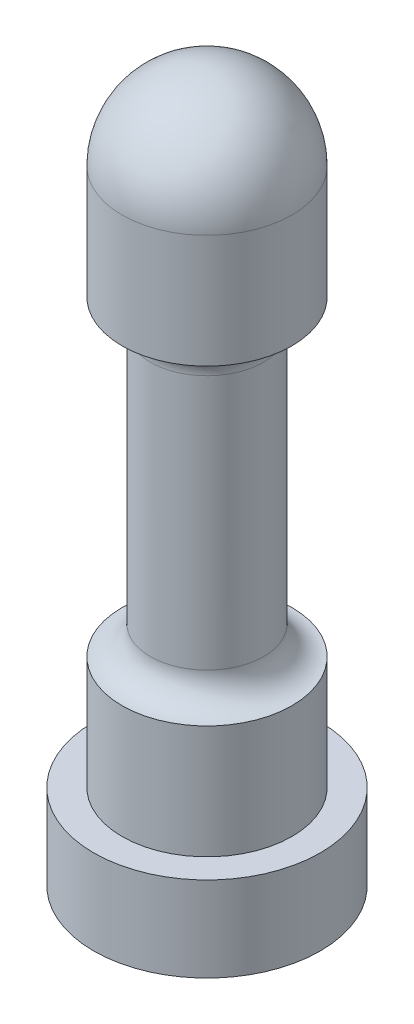
ISO-10303-21;
HEADER;
FILE_DESCRIPTION(('STEP AP214'),'2;1');
FILE_NAME('part.step','',(''),(''),'','','');
FILE_SCHEMA(('AUTOMOTIVE_DESIGN { 1 0 10303 214 1 1 1 1 }'));
ENDSEC;
DATA;
#1=APPLICATION_CONTEXT('core data for automotive mechanical design processes');
#2=APPLICATION_PROTOCOL_DEFINITION('international standard','automotive_design',2000,#1);
#3=PRODUCT_CONTEXT('',#1,'mechanical');
#4=PRODUCT('Part','Part','',(#3));
#5=PRODUCT_RELATED_PRODUCT_CATEGORY('part','',(#4));
#6=PRODUCT_DEFINITION_FORMATION('','',#4);
#7=PRODUCT_DEFINITION_CONTEXT('part definition',#1,'design');
#8=PRODUCT_DEFINITION('design','',#6,#7);
#9=PRODUCT_DEFINITION_SHAPE('','',#8);
#10=(LENGTH_UNIT() NAMED_UNIT(*) SI_UNIT(.MILLI.,.METRE.));
#11=(NAMED_UNIT(*) PLANE_ANGLE_UNIT() SI_UNIT($,.RADIAN.));
#12=(NAMED_UNIT(*) SI_UNIT($,.STERADIAN.) SOLID_ANGLE_UNIT());
#13=UNCERTAINTY_MEASURE_WITH_UNIT(LENGTH_MEASURE(1.E-05),#10,'distance_accuracy_value','');
#14=(GEOMETRIC_REPRESENTATION_CONTEXT(3) GLOBAL_UNCERTAINTY_ASSIGNED_CONTEXT((#13)) GLOBAL_UNIT_ASSIGNED_CONTEXT((#10,
#11,#12)) REPRESENTATION_CONTEXT('',''));
#15=CARTESIAN_POINT('',(0.,0.,0.));
#16=DIRECTION('',(0.,0.,1.));
#17=DIRECTION('',(1.,0.,0.));
#18=AXIS2_PLACEMENT_3D('',#15,#16,#17);
#19=CARTESIAN_POINT('',(0.,0.,0.));
#20=DIRECTION('',(0.,-1.,0.));
#21=DIRECTION('',(0.,0.,-1.));
#22=AXIS2_PLACEMENT_3D('',#19,#20,#21);
#23=PLANE('',#22);
#24=CARTESIAN_POINT('',(0.,0.,0.));
#25=DIRECTION('',(0.,1.,0.));
#26=DIRECTION('',(0.,0.,1.));
#27=AXIS2_PLACEMENT_3D('',#24,#25,#26);
#28=CIRCLE('',#27,2.82552232570277);
#29=CARTESIAN_POINT('',(0.,0.,2.82552232570277));
#30=VERTEX_POINT('',#29);
#31=EDGE_CURVE('E75',#30,#30,#28,.T.);
#32=ORIENTED_EDGE('',*,*,#31,.T.);
#33=EDGE_LOOP('',(#32));
#34=FACE_BOUND('',#33,.T.);
#35=CARTESIAN_POINT('',(0.,0.,0.));
#36=DIRECTION('',(0.,-1.,0.));
#37=DIRECTION('',(0.,0.,-1.));
#38=AXIS2_PLACEMENT_3D('',#35,#36,#37);
#39=CIRCLE('',#38,4.);
#40=CARTESIAN_POINT('',(0.,0.,-4.));
#41=VERTEX_POINT('',#40);
#42=EDGE_CURVE('E58',#41,#41,#39,.T.);
#43=ORIENTED_EDGE('',*,*,#42,.T.);
#44=EDGE_LOOP('',(#43));
#45=FACE_BOUND('',#44,.T.);
#46=ADVANCED_FACE('F43',(#34,#45),#23,.T.);
#47=CARTESIAN_POINT('',(0.,0.,0.));
#48=DIRECTION('',(0.,-1.,0.));
#49=DIRECTION('',(0.,0.,-1.));
#50=AXIS2_PLACEMENT_3D('',#47,#48,#49);
#51=CYLINDRICAL_SURFACE('',#50,4.);
#52=CARTESIAN_POINT('',(0.,3.,0.));
#53=DIRECTION('',(0.,-1.,0.));
#54=DIRECTION('',(0.,0.,-1.));
#55=AXIS2_PLACEMENT_3D('',#52,#53,#54);
#56=CIRCLE('',#55,4.);
#57=CARTESIAN_POINT('',(0.,3.,-4.));
#58=VERTEX_POINT('',#57);
#59=EDGE_CURVE('E63',#58,#58,#56,.T.);
#60=ORIENTED_EDGE('',*,*,#59,.T.);
#61=EDGE_LOOP('',(#60));
#62=FACE_BOUND('',#61,.T.);
#63=ORIENTED_EDGE('',*,*,#42,.F.);
#64=EDGE_LOOP('',(#63));
#65=FACE_BOUND('',#64,.T.);
#66=ADVANCED_FACE('F91',(#62,#65),#51,.T.);
#67=CARTESIAN_POINT('',(4.,3.,0.));
#68=DIRECTION('',(0.,1.,0.));
#69=DIRECTION('',(0.,0.,1.));
#70=AXIS2_PLACEMENT_3D('',#67,#68,#69);
#71=PLANE('',#70);
#72=CARTESIAN_POINT('',(0.,3.,0.));
#73=DIRECTION('',(0.,-1.,0.));
#74=DIRECTION('',(0.,0.,-1.));
#75=AXIS2_PLACEMENT_3D('',#72,#73,#74);
#76=CIRCLE('',#75,3.);
#77=CARTESIAN_POINT('',(0.,3.,-3.));
#78=VERTEX_POINT('',#77);
#79=EDGE_CURVE('E66',#78,#78,#76,.T.);
#80=ORIENTED_EDGE('',*,*,#79,.T.);
#81=EDGE_LOOP('',(#80));
#82=FACE_BOUND('',#81,.T.);
#83=ORIENTED_EDGE('',*,*,#59,.F.);
#84=EDGE_LOOP('',(#83));
#85=FACE_BOUND('',#84,.T.);
#86=ADVANCED_FACE('F96',(#82,#85),#71,.T.);
#87=CARTESIAN_POINT('',(0.,0.,0.));
#88=DIRECTION('',(0.,-1.,0.));
#89=DIRECTION('',(0.,0.,-1.));
#90=AXIS2_PLACEMENT_3D('',#87,#88,#89);
#91=CYLINDRICAL_SURFACE('',#90,3.);
#92=CARTESIAN_POINT('',(0.,7.,0.));
#93=DIRECTION('',(0.,-1.,0.));
#94=DIRECTION('',(0.,0.,-1.));
#95=AXIS2_PLACEMENT_3D('',#92,#93,#94);
#96=CIRCLE('',#95,3.);
#97=CARTESIAN_POINT('',(0.,7.,-3.));
#98=VERTEX_POINT('',#97);
#99=EDGE_CURVE('E69',#98,#98,#96,.T.);
#100=ORIENTED_EDGE('',*,*,#99,.T.);
#101=EDGE_LOOP('',(#100));
#102=FACE_BOUND('',#101,.T.);
#103=ORIENTED_EDGE('',*,*,#79,.F.);
#104=EDGE_LOOP('',(#103));
#105=FACE_BOUND('',#104,.T.);
#106=ADVANCED_FACE('F112',(#102,#105),#91,.T.);
#107=CARTESIAN_POINT('',(0.,0.,0.));
#108=DIRECTION('',(0.,-1.,0.));
#109=DIRECTION('',(0.,0.,-1.));
#110=AXIS2_PLACEMENT_3D('',#107,#108,#109);
#111=CYLINDRICAL_SURFACE('',#110,2.);
#112=CARTESIAN_POINT('',(0.,8.,0.));
#113=DIRECTION('',(0.,1.,0.));
#114=DIRECTION('',(0.,0.,1.));
#115=AXIS2_PLACEMENT_3D('',#112,#113,#114);
#116=CIRCLE('',#115,2.);
#117=CARTESIAN_POINT('',(0.,8.,2.));
#118=VERTEX_POINT('',#117);
#119=EDGE_CURVE('E12',#118,#118,#116,.T.);
#120=ORIENTED_EDGE('',*,*,#119,.T.);
#121=EDGE_LOOP('',(#120));
#122=FACE_BOUND('',#121,.T.);
#123=CARTESIAN_POINT('',(0.,17.,0.));
#124=DIRECTION('',(0.,-1.,0.));
#125=DIRECTION('',(0.,0.,-1.));
#126=AXIS2_PLACEMENT_3D('',#123,#124,#125);
#127=CIRCLE('',#126,2.);
#128=CARTESIAN_POINT('',(0.,17.,-2.));
#129=VERTEX_POINT('',#128);
#130=EDGE_CURVE('E50',#129,#129,#127,.T.);
#131=ORIENTED_EDGE('',*,*,#130,.T.);
#132=EDGE_LOOP('',(#131));
#133=FACE_BOUND('',#132,.T.);
#134=ADVANCED_FACE('F115',(#122,#133),#111,.T.);
#135=CARTESIAN_POINT('',(0.,0.,0.));
#136=DIRECTION('',(0.,-1.,0.));
#137=DIRECTION('',(0.,0.,-1.));
#138=AXIS2_PLACEMENT_3D('',#135,#136,#137);
#139=CYLINDRICAL_SURFACE('',#138,3.);
#140=CARTESIAN_POINT('',(0.,22.,0.));
#141=DIRECTION('',(0.,-1.,0.));
#142=DIRECTION('',(0.,0.,-1.));
#143=AXIS2_PLACEMENT_3D('',#140,#141,#142);
#144=CIRCLE('',#143,3.);
#145=CARTESIAN_POINT('',(0.,22.,-3.));
#146=VERTEX_POINT('',#145);
#147=EDGE_CURVE('E54',#146,#146,#144,.T.);
#148=ORIENTED_EDGE('',*,*,#147,.T.);
#149=EDGE_LOOP('',(#148));
#150=FACE_BOUND('',#149,.T.);
#151=CARTESIAN_POINT('',(0.,18.,0.));
#152=DIRECTION('',(0.,-1.,0.));
#153=DIRECTION('',(0.,0.,-1.));
#154=AXIS2_PLACEMENT_3D('',#151,#152,#153);
#155=CIRCLE('',#154,3.);
#156=CARTESIAN_POINT('',(0.,18.,-3.));
#157=VERTEX_POINT('',#156);
#158=EDGE_CURVE('E72',#157,#157,#155,.T.);
#159=ORIENTED_EDGE('',*,*,#158,.F.);
#160=EDGE_LOOP('',(#159));
#161=FACE_BOUND('',#160,.T.);
#162=ADVANCED_FACE('F103',(#150,#161),#139,.T.);
#163=CARTESIAN_POINT('',(0.,22.,0.));
#164=DIRECTION('',(0.,1.,0.));
#165=DIRECTION('',(0.,0.,1.));
#166=AXIS2_PLACEMENT_3D('',#163,#164,#165);
#167=SPHERICAL_SURFACE('',#166,3.);
#168=ORIENTED_EDGE('',*,*,#147,.F.);
#169=EDGE_LOOP('',(#168));
#170=FACE_BOUND('',#169,.T.);
#171=ADVANCED_FACE('F101',(#170),#167,.T.);
#172=CARTESIAN_POINT('',(0.,8.,0.));
#173=DIRECTION('',(0.,1.,0.));
#174=DIRECTION('',(0.,0.,1.));
#175=AXIS2_PLACEMENT_3D('',#172,#173,#174);
#176=TOROIDAL_SURFACE('',#175,3.,1.);
#177=ORIENTED_EDGE('',*,*,#119,.F.);
#178=EDGE_LOOP('',(#177));
#179=FACE_BOUND('',#178,.T.);
#180=ORIENTED_EDGE('',*,*,#99,.F.);
#181=EDGE_LOOP('',(#180));
#182=FACE_BOUND('',#181,.T.);
#183=ADVANCED_FACE('F87',(#179,#182),#176,.F.);
#184=CARTESIAN_POINT('',(0.,17.,0.));
#185=DIRECTION('',(0.,-1.,0.));
#186=DIRECTION('',(0.,0.,-1.));
#187=AXIS2_PLACEMENT_3D('',#184,#185,#186);
#188=TOROIDAL_SURFACE('',#187,3.,1.);
#189=ORIENTED_EDGE('',*,*,#158,.T.);
#190=EDGE_LOOP('',(#189));
#191=FACE_BOUND('',#190,.T.);
#192=ORIENTED_EDGE('',*,*,#130,.F.);
#193=EDGE_LOOP('',(#192));
#194=FACE_BOUND('',#193,.T.);
#195=ADVANCED_FACE('F45',(#191,#194),#188,.F.);
#196=CARTESIAN_POINT('',(0.,0.,0.));
#197=DIRECTION('',(0.,1.,0.));
#198=DIRECTION('',(1.,0.,0.));
#199=AXIS2_PLACEMENT_3D('',#196,#197,#198);
#200=SPHERICAL_SURFACE('',#199,2.82552232570277);
#201=ORIENTED_EDGE('',*,*,#31,.F.);
#202=EDGE_LOOP('',(#201));
#203=FACE_BOUND('',#202,.T.);
#204=ADVANCED_FACE('F81',(#203),#200,.F.);
#205=CLOSED_SHELL('',(#46,#66,#86,#106,#134,#162,#171,#183,#195,#204));
#206=MANIFOLD_SOLID_BREP('B2',#205);
#207=ADVANCED_BREP_SHAPE_REPRESENTATION('',(#18,#206),#14);
#208=SHAPE_DEFINITION_REPRESENTATION(#9,#207);
ENDSEC;
END-ISO-10303-21;
